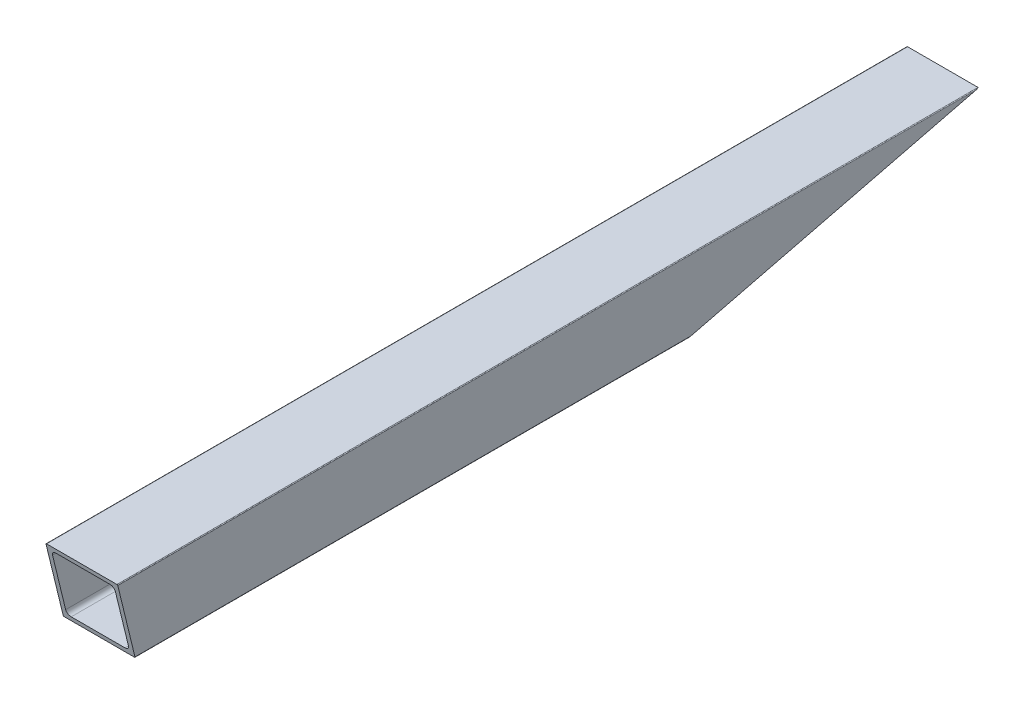
ISO-10303-21;
HEADER;
FILE_DESCRIPTION(('STEP AP214'),'2;1');
FILE_NAME('part.step','',(''),(''),'','','');
FILE_SCHEMA(('AUTOMOTIVE_DESIGN { 1 0 10303 214 1 1 1 1 }'));
ENDSEC;
DATA;
#1=APPLICATION_CONTEXT('core data for automotive mechanical design processes');
#2=APPLICATION_PROTOCOL_DEFINITION('international standard','automotive_design',2000,#1);
#3=PRODUCT_CONTEXT('',#1,'mechanical');
#4=PRODUCT('Part','Part','',(#3));
#5=PRODUCT_RELATED_PRODUCT_CATEGORY('part','',(#4));
#6=PRODUCT_DEFINITION_FORMATION('','',#4);
#7=PRODUCT_DEFINITION_CONTEXT('part definition',#1,'design');
#8=PRODUCT_DEFINITION('design','',#6,#7);
#9=PRODUCT_DEFINITION_SHAPE('','',#8);
#10=(LENGTH_UNIT() NAMED_UNIT(*) SI_UNIT(.MILLI.,.METRE.));
#11=(NAMED_UNIT(*) PLANE_ANGLE_UNIT() SI_UNIT($,.RADIAN.));
#12=(NAMED_UNIT(*) SI_UNIT($,.STERADIAN.) SOLID_ANGLE_UNIT());
#13=UNCERTAINTY_MEASURE_WITH_UNIT(LENGTH_MEASURE(1.E-05),#10,'distance_accuracy_value','');
#14=(GEOMETRIC_REPRESENTATION_CONTEXT(3) GLOBAL_UNCERTAINTY_ASSIGNED_CONTEXT((#13)) GLOBAL_UNIT_ASSIGNED_CONTEXT((#10,
#11,#12)) REPRESENTATION_CONTEXT('',''));
#15=CARTESIAN_POINT('',(0.,0.,0.));
#16=DIRECTION('',(0.,0.,1.));
#17=DIRECTION('',(1.,0.,0.));
#18=AXIS2_PLACEMENT_3D('',#15,#16,#17);
#19=CARTESIAN_POINT('',(1.5875,3.175,1828.8));
#20=DIRECTION('',(1.,0.,0.));
#21=DIRECTION('',(0.,1.,0.));
#22=AXIS2_PLACEMENT_3D('',#19,#20,#21);
#23=PLANE('',#22);
#24=DIRECTION('',(0.,0.971498515495055,0.237045637780794));
#25=VECTOR('',#24,1.);
#26=CARTESIAN_POINT('',(1.5875,227.283946970997,910.320709135263));
#27=LINE('',#26,#25);
#28=CARTESIAN_POINT('',(1.5875,3.175,855.638126074339));
#29=VERTEX_POINT('',#28);
#30=CARTESIAN_POINT('',(1.5875,22.225,860.286326074339));
#31=VERTEX_POINT('',#30);
#32=EDGE_CURVE('E290',#29,#31,#27,.T.);
#33=ORIENTED_EDGE('',*,*,#32,.F.);
#34=DIRECTION('',(0.,0.,-1.));
#35=VECTOR('',#34,1.);
#36=CARTESIAN_POINT('',(1.5875,3.175,1828.8));
#37=LINE('',#36,#35);
#38=CARTESIAN_POINT('',(1.5875,3.175,646.321667142212));
#39=VERTEX_POINT('',#38);
#40=EDGE_CURVE('E210',#29,#39,#37,.T.);
#41=ORIENTED_EDGE('',*,*,#40,.T.);
#42=DIRECTION('',(0.,-0.239881906612022,0.970802076058854));
#43=VECTOR('',#42,1.);
#44=CARTESIAN_POINT('',(1.5875,-272.198015313343,1760.75626011531));
#45=LINE('',#44,#43);
#46=CARTESIAN_POINT('',(1.5875,22.225,569.226317142212));
#47=VERTEX_POINT('',#46);
#48=EDGE_CURVE('E231',#47,#39,#45,.T.);
#49=ORIENTED_EDGE('',*,*,#48,.F.);
#50=DIRECTION('',(0.,0.,-1.));
#51=VECTOR('',#50,1.);
#52=CARTESIAN_POINT('',(1.5875,22.225,1828.8));
#53=LINE('',#52,#51);
#54=EDGE_CURVE('E194',#31,#47,#53,.T.);
#55=ORIENTED_EDGE('',*,*,#54,.F.);
#56=EDGE_LOOP('',(#33,#41,#49,#55));
#57=FACE_BOUND('',#56,.T.);
#58=ADVANCED_FACE('F41',(#57),#23,.T.);
#59=CARTESIAN_POINT('',(3.175,22.225,1828.8));
#60=DIRECTION('',(0.,0.,-1.));
#61=DIRECTION('',(-1.,0.,0.));
#62=AXIS2_PLACEMENT_3D('',#59,#60,#61);
#63=CYLINDRICAL_SURFACE('',#62,1.5875);
#64=DIRECTION('',(0.,0.,-1.));
#65=VECTOR('',#64,1.);
#66=CARTESIAN_POINT('',(3.175,23.8125,1828.8));
#67=LINE('',#66,#65);
#68=CARTESIAN_POINT('',(3.175,23.8125,860.673676074339));
#69=VERTEX_POINT('',#68);
#70=CARTESIAN_POINT('',(3.175,23.8125,562.801704642212));
#71=VERTEX_POINT('',#70);
#72=EDGE_CURVE('E192',#69,#71,#67,.T.);
#73=ORIENTED_EDGE('',*,*,#72,.F.);
#74=CARTESIAN_POINT('',(3.175,22.225,860.286326074339));
#75=DIRECTION('',(0.,0.237045637780794,-0.971498515495055));
#76=DIRECTION('',(0.,-0.971498515495055,-0.237045637780794));
#77=AXIS2_PLACEMENT_3D('',#74,#75,#76);
#78=ELLIPSE('',#77,1.63407352114279,1.5875);
#79=EDGE_CURVE('E292',#69,#31,#78,.F.);
#80=ORIENTED_EDGE('',*,*,#79,.T.);
#81=ORIENTED_EDGE('',*,*,#54,.T.);
#82=CARTESIAN_POINT('',(3.175,22.225,569.226317142212));
#83=DIRECTION('',(0.,0.970802076058854,0.239881906612022));
#84=DIRECTION('',(0.,0.239881906612022,-0.970802076058854));
#85=AXIS2_PLACEMENT_3D('',#82,#83,#84);
#86=ELLIPSE('',#85,6.61783967962024,1.5875);
#87=EDGE_CURVE('E235',#47,#71,#86,.F.);
#88=ORIENTED_EDGE('',*,*,#87,.T.);
#89=EDGE_LOOP('',(#73,#80,#81,#88));
#90=FACE_BOUND('',#89,.T.);
#91=ADVANCED_FACE('F331',(#90),#63,.F.);
#92=CARTESIAN_POINT('',(3.175,23.8125,1828.8));
#93=DIRECTION('',(0.,-1.,0.));
#94=DIRECTION('',(0.,0.,-1.));
#95=AXIS2_PLACEMENT_3D('',#92,#93,#94);
#96=PLANE('',#95);
#97=DIRECTION('',(1.,0.,0.));
#98=VECTOR('',#97,1.);
#99=CARTESIAN_POINT('',(3.175,23.8125,860.673676074339));
#100=LINE('',#99,#98);
#101=CARTESIAN_POINT('',(22.225,23.8125,860.673676074339));
#102=VERTEX_POINT('',#101);
#103=EDGE_CURVE('E294',#69,#102,#100,.T.);
#104=ORIENTED_EDGE('',*,*,#103,.F.);
#105=ORIENTED_EDGE('',*,*,#72,.T.);
#106=DIRECTION('',(-1.,0.,0.));
#107=VECTOR('',#106,1.);
#108=CARTESIAN_POINT('',(3.175,23.8125,562.801704642212));
#109=LINE('',#108,#107);
#110=CARTESIAN_POINT('',(22.225,23.8125,562.801704642212));
#111=VERTEX_POINT('',#110);
#112=EDGE_CURVE('E240',#111,#71,#109,.T.);
#113=ORIENTED_EDGE('',*,*,#112,.F.);
#114=DIRECTION('',(0.,0.,-1.));
#115=VECTOR('',#114,1.);
#116=CARTESIAN_POINT('',(22.225,23.8125,1828.8));
#117=LINE('',#116,#115);
#118=EDGE_CURVE('E191',#102,#111,#117,.T.);
#119=ORIENTED_EDGE('',*,*,#118,.F.);
#120=EDGE_LOOP('',(#104,#105,#113,#119));
#121=FACE_BOUND('',#120,.T.);
#122=ADVANCED_FACE('F336',(#121),#96,.T.);
#123=CARTESIAN_POINT('',(22.225,22.225,1828.8));
#124=DIRECTION('',(0.,0.,-1.));
#125=DIRECTION('',(-1.,0.,0.));
#126=AXIS2_PLACEMENT_3D('',#123,#124,#125);
#127=CYLINDRICAL_SURFACE('',#126,1.5875);
#128=DIRECTION('',(0.,0.,-1.));
#129=VECTOR('',#128,1.);
#130=CARTESIAN_POINT('',(23.8125,22.225,1828.8));
#131=LINE('',#130,#129);
#132=CARTESIAN_POINT('',(23.8125,22.225,860.286326074339));
#133=VERTEX_POINT('',#132);
#134=CARTESIAN_POINT('',(23.8125,22.225,569.226317142211));
#135=VERTEX_POINT('',#134);
#136=EDGE_CURVE('E187',#133,#135,#131,.T.);
#137=ORIENTED_EDGE('',*,*,#136,.F.);
#138=CARTESIAN_POINT('',(22.225,22.225,860.286326074339));
#139=DIRECTION('',(0.,0.237045637780794,-0.971498515495055));
#140=DIRECTION('',(0.,-0.971498515495055,-0.237045637780794));
#141=AXIS2_PLACEMENT_3D('',#138,#139,#140);
#142=ELLIPSE('',#141,1.63407352114279,1.5875);
#143=EDGE_CURVE('E296',#133,#102,#142,.F.);
#144=ORIENTED_EDGE('',*,*,#143,.T.);
#145=ORIENTED_EDGE('',*,*,#118,.T.);
#146=CARTESIAN_POINT('',(22.225,22.225,569.226317142212));
#147=DIRECTION('',(0.,0.970802076058854,0.239881906612022));
#148=DIRECTION('',(0.,0.239881906612022,-0.970802076058854));
#149=AXIS2_PLACEMENT_3D('',#146,#147,#148);
#150=ELLIPSE('',#149,6.61783967962024,1.5875);
#151=EDGE_CURVE('E261',#111,#135,#150,.F.);
#152=ORIENTED_EDGE('',*,*,#151,.T.);
#153=EDGE_LOOP('',(#137,#144,#145,#152));
#154=FACE_BOUND('',#153,.T.);
#155=ADVANCED_FACE('F267',(#154),#127,.F.);
#156=CARTESIAN_POINT('',(23.8125,3.175,1828.8));
#157=DIRECTION('',(-1.,0.,0.));
#158=DIRECTION('',(0.,0.,1.));
#159=AXIS2_PLACEMENT_3D('',#156,#157,#158);
#160=PLANE('',#159);
#161=DIRECTION('',(0.,-0.971498515495055,-0.237045637780794));
#162=VECTOR('',#161,1.);
#163=CARTESIAN_POINT('',(23.8125,227.283946970997,910.320709135263));
#164=LINE('',#163,#162);
#165=CARTESIAN_POINT('',(23.8125,3.175,855.638126074339));
#166=VERTEX_POINT('',#165);
#167=EDGE_CURVE('E253',#133,#166,#164,.T.);
#168=ORIENTED_EDGE('',*,*,#167,.F.);
#169=ORIENTED_EDGE('',*,*,#136,.T.);
#170=DIRECTION('',(0.,0.239881906612022,-0.970802076058854));
#171=VECTOR('',#170,1.);
#172=CARTESIAN_POINT('',(23.8125,-272.198015313343,1760.75626011531));
#173=LINE('',#172,#171);
#174=CARTESIAN_POINT('',(23.8125,3.175,646.321667142212));
#175=VERTEX_POINT('',#174);
#176=EDGE_CURVE('E252',#175,#135,#173,.T.);
#177=ORIENTED_EDGE('',*,*,#176,.F.);
#178=DIRECTION('',(0.,0.,-1.));
#179=VECTOR('',#178,1.);
#180=CARTESIAN_POINT('',(23.8125,3.175,1828.8));
#181=LINE('',#180,#179);
#182=EDGE_CURVE('E185',#166,#175,#181,.T.);
#183=ORIENTED_EDGE('',*,*,#182,.F.);
#184=EDGE_LOOP('',(#168,#169,#177,#183));
#185=FACE_BOUND('',#184,.T.);
#186=ADVANCED_FACE('F250',(#185),#160,.T.);
#187=CARTESIAN_POINT('',(22.225,3.175,1828.8));
#188=DIRECTION('',(0.,0.,-1.));
#189=DIRECTION('',(-1.,0.,0.));
#190=AXIS2_PLACEMENT_3D('',#187,#188,#189);
#191=CYLINDRICAL_SURFACE('',#190,1.5875);
#192=DIRECTION('',(0.,0.,-1.));
#193=VECTOR('',#192,1.);
#194=CARTESIAN_POINT('',(22.225,1.5875,1828.8));
#195=LINE('',#194,#193);
#196=CARTESIAN_POINT('',(22.225,1.5875,855.250776074339));
#197=VERTEX_POINT('',#196);
#198=CARTESIAN_POINT('',(22.225,1.5875,652.746279642212));
#199=VERTEX_POINT('',#198);
#200=EDGE_CURVE('E188',#197,#199,#195,.T.);
#201=ORIENTED_EDGE('',*,*,#200,.F.);
#202=CARTESIAN_POINT('',(22.225,3.175,855.638126074339));
#203=DIRECTION('',(0.,0.237045637780794,-0.971498515495055));
#204=DIRECTION('',(0.,-0.971498515495055,-0.237045637780794));
#205=AXIS2_PLACEMENT_3D('',#202,#203,#204);
#206=ELLIPSE('',#205,1.63407352114279,1.5875);
#207=EDGE_CURVE('E299',#197,#166,#206,.F.);
#208=ORIENTED_EDGE('',*,*,#207,.T.);
#209=ORIENTED_EDGE('',*,*,#182,.T.);
#210=CARTESIAN_POINT('',(22.225,3.175,646.321667142212));
#211=DIRECTION('',(0.,0.970802076058854,0.239881906612022));
#212=DIRECTION('',(0.,0.239881906612022,-0.970802076058854));
#213=AXIS2_PLACEMENT_3D('',#210,#211,#212);
#214=ELLIPSE('',#213,6.61783967962024,1.5875);
#215=EDGE_CURVE('E265',#175,#199,#214,.F.);
#216=ORIENTED_EDGE('',*,*,#215,.T.);
#217=EDGE_LOOP('',(#201,#208,#209,#216));
#218=FACE_BOUND('',#217,.T.);
#219=ADVANCED_FACE('F346',(#218),#191,.F.);
#220=CARTESIAN_POINT('',(3.175,1.5875,1828.8));
#221=DIRECTION('',(0.,1.,0.));
#222=DIRECTION('',(1.,0.,0.));
#223=AXIS2_PLACEMENT_3D('',#220,#221,#222);
#224=PLANE('',#223);
#225=DIRECTION('',(-1.,0.,0.));
#226=VECTOR('',#225,1.);
#227=CARTESIAN_POINT('',(3.175,1.5875,855.250776074339));
#228=LINE('',#227,#226);
#229=CARTESIAN_POINT('',(3.175,1.5875,855.250776074339));
#230=VERTEX_POINT('',#229);
#231=EDGE_CURVE('E55',#197,#230,#228,.T.);
#232=ORIENTED_EDGE('',*,*,#231,.F.);
#233=ORIENTED_EDGE('',*,*,#200,.T.);
#234=DIRECTION('',(1.,0.,0.));
#235=VECTOR('',#234,1.);
#236=CARTESIAN_POINT('',(3.175,1.5875,652.746279642212));
#237=LINE('',#236,#235);
#238=CARTESIAN_POINT('',(3.175,1.5875,652.746279642212));
#239=VERTEX_POINT('',#238);
#240=EDGE_CURVE('E272',#239,#199,#237,.T.);
#241=ORIENTED_EDGE('',*,*,#240,.F.);
#242=DIRECTION('',(0.,0.,-1.));
#243=VECTOR('',#242,1.);
#244=CARTESIAN_POINT('',(3.175,1.5875,1828.8));
#245=LINE('',#244,#243);
#246=EDGE_CURVE('E211',#230,#239,#245,.T.);
#247=ORIENTED_EDGE('',*,*,#246,.F.);
#248=EDGE_LOOP('',(#232,#233,#241,#247));
#249=FACE_BOUND('',#248,.T.);
#250=ADVANCED_FACE('F343',(#249),#224,.T.);
#251=CARTESIAN_POINT('',(3.175,3.175,1828.8));
#252=DIRECTION('',(0.,0.,-1.));
#253=DIRECTION('',(-1.,0.,0.));
#254=AXIS2_PLACEMENT_3D('',#251,#252,#253);
#255=CYLINDRICAL_SURFACE('',#254,1.5875);
#256=ORIENTED_EDGE('',*,*,#40,.F.);
#257=CARTESIAN_POINT('',(3.175,3.175,855.638126074339));
#258=DIRECTION('',(0.,0.237045637780794,-0.971498515495055));
#259=DIRECTION('',(0.,-0.971498515495055,-0.237045637780794));
#260=AXIS2_PLACEMENT_3D('',#257,#258,#259);
#261=ELLIPSE('',#260,1.63407352114279,1.5875);
#262=EDGE_CURVE('E303',#29,#230,#261,.F.);
#263=ORIENTED_EDGE('',*,*,#262,.T.);
#264=ORIENTED_EDGE('',*,*,#246,.T.);
#265=CARTESIAN_POINT('',(3.175,3.175,646.321667142212));
#266=DIRECTION('',(0.,0.970802076058854,0.239881906612022));
#267=DIRECTION('',(0.,0.239881906612022,-0.970802076058854));
#268=AXIS2_PLACEMENT_3D('',#265,#266,#267);
#269=ELLIPSE('',#268,6.61783967962024,1.5875);
#270=EDGE_CURVE('E274',#239,#39,#269,.F.);
#271=ORIENTED_EDGE('',*,*,#270,.T.);
#272=EDGE_LOOP('',(#256,#263,#264,#271));
#273=FACE_BOUND('',#272,.T.);
#274=ADVANCED_FACE('F339',(#273),#255,.F.);
#275=CARTESIAN_POINT('',(0.,0.254,1828.8));
#276=DIRECTION('',(1.,0.,0.));
#277=DIRECTION('',(0.,1.,0.));
#278=AXIS2_PLACEMENT_3D('',#275,#276,#277);
#279=PLANE('',#278);
#280=DIRECTION('',(0.,0.,-1.));
#281=VECTOR('',#280,1.);
#282=CARTESIAN_POINT('',(0.,0.254,1828.8));
#283=LINE('',#282,#281);
#284=CARTESIAN_POINT('',(0.,0.254,854.925402074339));
#285=VERTEX_POINT('',#284);
#286=CARTESIAN_POINT('',(0.,0.254,658.142954142211));
#287=VERTEX_POINT('',#286);
#288=EDGE_CURVE('E179',#285,#287,#283,.T.);
#289=ORIENTED_EDGE('',*,*,#288,.F.);
#290=DIRECTION('',(0.,0.971498515495055,0.237045637780794));
#291=VECTOR('',#290,1.);
#292=CARTESIAN_POINT('',(0.,224.527079814053,909.648033548968));
#293=LINE('',#292,#291);
#294=CARTESIAN_POINT('',(0.,25.146,860.999050074339));
#295=VERTEX_POINT('',#294);
#296=EDGE_CURVE('E62',#285,#295,#293,.T.);
#297=ORIENTED_EDGE('',*,*,#296,.T.);
#298=DIRECTION('',(0.,0.,-1.));
#299=VECTOR('',#298,1.);
#300=CARTESIAN_POINT('',(0.,25.146,1828.8));
#301=LINE('',#300,#299);
#302=CARTESIAN_POINT('',(0.,25.146,557.405030142211));
#303=VERTEX_POINT('',#302);
#304=EDGE_CURVE('E208',#295,#303,#301,.T.);
#305=ORIENTED_EDGE('',*,*,#304,.T.);
#306=DIRECTION('',(0.,-0.239881906612022,0.970802076058854));
#307=VECTOR('',#306,1.);
#308=CARTESIAN_POINT('',(0.,-272.366099377702,1761.43649632377));
#309=LINE('',#308,#307);
#310=EDGE_CURVE('E282',#303,#287,#309,.T.);
#311=ORIENTED_EDGE('',*,*,#310,.T.);
#312=EDGE_LOOP('',(#289,#297,#305,#311));
#313=FACE_BOUND('',#312,.T.);
#314=ADVANCED_FACE('F316',(#313),#279,.F.);
#315=CARTESIAN_POINT('',(0.254,25.146,1828.8));
#316=DIRECTION('',(0.,0.,-1.));
#317=DIRECTION('',(-1.,0.,0.));
#318=AXIS2_PLACEMENT_3D('',#315,#316,#317);
#319=CYLINDRICAL_SURFACE('',#318,0.254);
#320=CARTESIAN_POINT('',(0.254,25.146,860.999050074339));
#321=DIRECTION('',(0.,0.237045637780794,-0.971498515495055));
#322=DIRECTION('',(0.,-0.971498515495055,-0.237045637780794));
#323=AXIS2_PLACEMENT_3D('',#320,#321,#322);
#324=ELLIPSE('',#323,0.261451763382847,0.254);
#325=CARTESIAN_POINT('',(0.254000000000004,25.4,861.061026074339));
#326=VERTEX_POINT('',#325);
#327=EDGE_CURVE('E161',#326,#295,#324,.F.);
#328=ORIENTED_EDGE('',*,*,#327,.F.);
#329=DIRECTION('',(0.,0.,-1.));
#330=VECTOR('',#329,1.);
#331=CARTESIAN_POINT('',(0.254,25.4,1828.8));
#332=LINE('',#331,#330);
#333=CARTESIAN_POINT('',(0.254000000000004,25.4,556.377092142212));
#334=VERTEX_POINT('',#333);
#335=EDGE_CURVE('E183',#326,#334,#332,.T.);
#336=ORIENTED_EDGE('',*,*,#335,.T.);
#337=CARTESIAN_POINT('',(0.254,25.146,557.405030142212));
#338=DIRECTION('',(0.,0.970802076058854,0.239881906612022));
#339=DIRECTION('',(0.,0.239881906612022,-0.970802076058854));
#340=AXIS2_PLACEMENT_3D('',#337,#338,#339);
#341=ELLIPSE('',#340,1.05885434873924,0.254);
#342=EDGE_CURVE('E280',#303,#334,#341,.F.);
#343=ORIENTED_EDGE('',*,*,#342,.F.);
#344=ORIENTED_EDGE('',*,*,#304,.F.);
#345=EDGE_LOOP('',(#328,#336,#343,#344));
#346=FACE_BOUND('',#345,.T.);
#347=ADVANCED_FACE('F314',(#346),#319,.T.);
#348=CARTESIAN_POINT('',(0.254,25.4,1828.8));
#349=DIRECTION('',(0.,-1.,0.));
#350=DIRECTION('',(0.,0.,-1.));
#351=AXIS2_PLACEMENT_3D('',#348,#349,#350);
#352=PLANE('',#351);
#353=ORIENTED_EDGE('',*,*,#335,.F.);
#354=DIRECTION('',(1.,0.,0.));
#355=VECTOR('',#354,1.);
#356=CARTESIAN_POINT('',(-71.374,25.4,861.061026074339));
#357=LINE('',#356,#355);
#358=CARTESIAN_POINT('',(25.146,25.4,861.061026074339));
#359=VERTEX_POINT('',#358);
#360=EDGE_CURVE('E308',#326,#359,#357,.T.);
#361=ORIENTED_EDGE('',*,*,#360,.T.);
#362=DIRECTION('',(0.,0.,-1.));
#363=VECTOR('',#362,1.);
#364=CARTESIAN_POINT('',(25.146,25.4,1828.8));
#365=LINE('',#364,#363);
#366=CARTESIAN_POINT('',(25.146,25.4,556.377092142212));
#367=VERTEX_POINT('',#366);
#368=EDGE_CURVE('E177',#359,#367,#365,.T.);
#369=ORIENTED_EDGE('',*,*,#368,.T.);
#370=DIRECTION('',(1.,0.,0.));
#371=VECTOR('',#370,1.);
#372=CARTESIAN_POINT('',(-71.374,25.4,556.377092142212));
#373=LINE('',#372,#371);
#374=EDGE_CURVE('E285',#334,#367,#373,.T.);
#375=ORIENTED_EDGE('',*,*,#374,.F.);
#376=EDGE_LOOP('',(#353,#361,#369,#375));
#377=FACE_BOUND('',#376,.T.);
#378=ADVANCED_FACE('F310',(#377),#352,.F.);
#379=CARTESIAN_POINT('',(25.146,25.146,1828.8));
#380=DIRECTION('',(0.,0.,-1.));
#381=DIRECTION('',(-1.,0.,0.));
#382=AXIS2_PLACEMENT_3D('',#379,#380,#381);
#383=CYLINDRICAL_SURFACE('',#382,0.254);
#384=CARTESIAN_POINT('',(25.146,25.146,860.999050074339));
#385=DIRECTION('',(0.,0.237045637780794,-0.971498515495055));
#386=DIRECTION('',(0.,-0.971498515495055,-0.237045637780794));
#387=AXIS2_PLACEMENT_3D('',#384,#385,#386);
#388=ELLIPSE('',#387,0.261451763382847,0.254);
#389=CARTESIAN_POINT('',(25.4,25.146,860.999050074339));
#390=VERTEX_POINT('',#389);
#391=EDGE_CURVE('E160',#390,#359,#388,.F.);
#392=ORIENTED_EDGE('',*,*,#391,.F.);
#393=DIRECTION('',(0.,0.,-1.));
#394=VECTOR('',#393,1.);
#395=CARTESIAN_POINT('',(25.4,25.146,1828.8));
#396=LINE('',#395,#394);
#397=CARTESIAN_POINT('',(25.4,25.1460000000001,557.405030142211));
#398=VERTEX_POINT('',#397);
#399=EDGE_CURVE('E169',#390,#398,#396,.T.);
#400=ORIENTED_EDGE('',*,*,#399,.T.);
#401=CARTESIAN_POINT('',(25.146,25.146,557.405030142212));
#402=DIRECTION('',(0.,0.970802076058854,0.239881906612022));
#403=DIRECTION('',(0.,0.239881906612022,-0.970802076058854));
#404=AXIS2_PLACEMENT_3D('',#401,#402,#403);
#405=ELLIPSE('',#404,1.05885434873924,0.254);
#406=EDGE_CURVE('E276',#367,#398,#405,.F.);
#407=ORIENTED_EDGE('',*,*,#406,.F.);
#408=ORIENTED_EDGE('',*,*,#368,.F.);
#409=EDGE_LOOP('',(#392,#400,#407,#408));
#410=FACE_BOUND('',#409,.T.);
#411=ADVANCED_FACE('F313',(#410),#383,.T.);
#412=CARTESIAN_POINT('',(25.4,0.254,1828.8));
#413=DIRECTION('',(-1.,0.,0.));
#414=DIRECTION('',(0.,0.,1.));
#415=AXIS2_PLACEMENT_3D('',#412,#413,#414);
#416=PLANE('',#415);
#417=ORIENTED_EDGE('',*,*,#399,.F.);
#418=DIRECTION('',(0.,0.971498515495055,0.237045637780794));
#419=VECTOR('',#418,1.);
#420=CARTESIAN_POINT('',(25.4,25.4,861.061026074339));
#421=LINE('',#420,#419);
#422=CARTESIAN_POINT('',(25.4,0.253999999999997,854.925402074339));
#423=VERTEX_POINT('',#422);
#424=EDGE_CURVE('E153',#423,#390,#421,.T.);
#425=ORIENTED_EDGE('',*,*,#424,.F.);
#426=DIRECTION('',(0.,0.,-1.));
#427=VECTOR('',#426,1.);
#428=CARTESIAN_POINT('',(25.4,0.254,1828.8));
#429=LINE('',#428,#427);
#430=CARTESIAN_POINT('',(25.4,0.254000000000171,658.14295414221));
#431=VERTEX_POINT('',#430);
#432=EDGE_CURVE('E167',#423,#431,#429,.T.);
#433=ORIENTED_EDGE('',*,*,#432,.T.);
#434=DIRECTION('',(0.,-0.239881906612022,0.970802076058854));
#435=VECTOR('',#434,1.);
#436=CARTESIAN_POINT('',(25.4,0.,659.170892142212));
#437=LINE('',#436,#435);
#438=EDGE_CURVE('E287',#398,#431,#437,.T.);
#439=ORIENTED_EDGE('',*,*,#438,.F.);
#440=EDGE_LOOP('',(#417,#425,#433,#439));
#441=FACE_BOUND('',#440,.T.);
#442=ADVANCED_FACE('F165',(#441),#416,.F.);
#443=CARTESIAN_POINT('',(25.146,0.254,1828.8));
#444=DIRECTION('',(0.,0.,-1.));
#445=DIRECTION('',(-1.,0.,0.));
#446=AXIS2_PLACEMENT_3D('',#443,#444,#445);
#447=CYLINDRICAL_SURFACE('',#446,0.254);
#448=CARTESIAN_POINT('',(25.146,0.254,854.925402074339));
#449=DIRECTION('',(0.,0.237045637780794,-0.971498515495055));
#450=DIRECTION('',(0.,-0.971498515495055,-0.237045637780794));
#451=AXIS2_PLACEMENT_3D('',#448,#449,#450);
#452=ELLIPSE('',#451,0.261451763382847,0.254);
#453=CARTESIAN_POINT('',(25.146,0.,854.863426074339));
#454=VERTEX_POINT('',#453);
#455=EDGE_CURVE('E150',#454,#423,#452,.F.);
#456=ORIENTED_EDGE('',*,*,#455,.F.);
#457=DIRECTION('',(0.,0.,-1.));
#458=VECTOR('',#457,1.);
#459=CARTESIAN_POINT('',(25.146,0.,1828.8));
#460=LINE('',#459,#458);
#461=CARTESIAN_POINT('',(25.146,0.,659.170892142212));
#462=VERTEX_POINT('',#461);
#463=EDGE_CURVE('E175',#454,#462,#460,.T.);
#464=ORIENTED_EDGE('',*,*,#463,.T.);
#465=CARTESIAN_POINT('',(25.146,0.254,658.142954142211));
#466=DIRECTION('',(0.,0.970802076058854,0.239881906612022));
#467=DIRECTION('',(0.,0.239881906612022,-0.970802076058854));
#468=AXIS2_PLACEMENT_3D('',#465,#466,#467);
#469=ELLIPSE('',#468,1.05885434873924,0.254);
#470=EDGE_CURVE('E174',#431,#462,#469,.F.);
#471=ORIENTED_EDGE('',*,*,#470,.F.);
#472=ORIENTED_EDGE('',*,*,#432,.F.);
#473=EDGE_LOOP('',(#456,#464,#471,#472));
#474=FACE_BOUND('',#473,.T.);
#475=ADVANCED_FACE('F172',(#474),#447,.T.);
#476=CARTESIAN_POINT('',(0.254,0.,1828.8));
#477=DIRECTION('',(0.,1.,0.));
#478=DIRECTION('',(1.,0.,0.));
#479=AXIS2_PLACEMENT_3D('',#476,#477,#478);
#480=PLANE('',#479);
#481=ORIENTED_EDGE('',*,*,#463,.F.);
#482=DIRECTION('',(1.,0.,0.));
#483=VECTOR('',#482,1.);
#484=CARTESIAN_POINT('',(-71.374,0.,854.863426074339));
#485=LINE('',#484,#483);
#486=CARTESIAN_POINT('',(0.254000000000004,0.,854.863426074339));
#487=VERTEX_POINT('',#486);
#488=EDGE_CURVE('E156',#487,#454,#485,.T.);
#489=ORIENTED_EDGE('',*,*,#488,.F.);
#490=DIRECTION('',(0.,0.,-1.));
#491=VECTOR('',#490,1.);
#492=CARTESIAN_POINT('',(0.254,0.,1828.8));
#493=LINE('',#492,#491);
#494=CARTESIAN_POINT('',(0.254,0.,659.170892142212));
#495=VERTEX_POINT('',#494);
#496=EDGE_CURVE('E190',#487,#495,#493,.T.);
#497=ORIENTED_EDGE('',*,*,#496,.T.);
#498=DIRECTION('',(1.,0.,0.));
#499=VECTOR('',#498,1.);
#500=CARTESIAN_POINT('',(-71.374,0.,659.170892142212));
#501=LINE('',#500,#499);
#502=EDGE_CURVE('E284',#495,#462,#501,.T.);
#503=ORIENTED_EDGE('',*,*,#502,.T.);
#504=EDGE_LOOP('',(#481,#489,#497,#503));
#505=FACE_BOUND('',#504,.T.);
#506=ADVANCED_FACE('F319',(#505),#480,.F.);
#507=CARTESIAN_POINT('',(0.254,0.254,1828.8));
#508=DIRECTION('',(0.,0.,-1.));
#509=DIRECTION('',(-1.,0.,0.));
#510=AXIS2_PLACEMENT_3D('',#507,#508,#509);
#511=CYLINDRICAL_SURFACE('',#510,0.254);
#512=CARTESIAN_POINT('',(0.254,0.254,854.925402074339));
#513=DIRECTION('',(0.,0.237045637780794,-0.971498515495055));
#514=DIRECTION('',(0.,-0.971498515495055,-0.237045637780794));
#515=AXIS2_PLACEMENT_3D('',#512,#513,#514);
#516=ELLIPSE('',#515,0.261451763382847,0.254);
#517=EDGE_CURVE('E11',#285,#487,#516,.F.);
#518=ORIENTED_EDGE('',*,*,#517,.F.);
#519=ORIENTED_EDGE('',*,*,#288,.T.);
#520=CARTESIAN_POINT('',(0.254,0.254,658.142954142211));
#521=DIRECTION('',(0.,0.970802076058854,0.239881906612022));
#522=DIRECTION('',(0.,0.239881906612022,-0.970802076058854));
#523=AXIS2_PLACEMENT_3D('',#520,#521,#522);
#524=ELLIPSE('',#523,1.05885434873924,0.254);
#525=EDGE_CURVE('E48',#495,#287,#524,.F.);
#526=ORIENTED_EDGE('',*,*,#525,.F.);
#527=ORIENTED_EDGE('',*,*,#496,.F.);
#528=EDGE_LOOP('',(#518,#519,#526,#527));
#529=FACE_BOUND('',#528,.T.);
#530=ADVANCED_FACE('F318',(#529),#511,.T.);
#531=CARTESIAN_POINT('',(-71.374,0.,659.170892142212));
#532=DIRECTION('',(0.,0.970802076058854,0.239881906612022));
#533=DIRECTION('',(0.,-0.239881906612022,0.970802076058854));
#534=AXIS2_PLACEMENT_3D('',#531,#532,#533);
#535=PLANE('',#534);
#536=ORIENTED_EDGE('',*,*,#48,.T.);
#537=ORIENTED_EDGE('',*,*,#270,.F.);
#538=ORIENTED_EDGE('',*,*,#240,.T.);
#539=ORIENTED_EDGE('',*,*,#215,.F.);
#540=ORIENTED_EDGE('',*,*,#176,.T.);
#541=ORIENTED_EDGE('',*,*,#151,.F.);
#542=ORIENTED_EDGE('',*,*,#112,.T.);
#543=ORIENTED_EDGE('',*,*,#87,.F.);
#544=EDGE_LOOP('',(#536,#537,#538,#539,#540,#541,#542,#543));
#545=FACE_BOUND('',#544,.T.);
#546=ORIENTED_EDGE('',*,*,#406,.T.);
#547=ORIENTED_EDGE('',*,*,#438,.T.);
#548=ORIENTED_EDGE('',*,*,#470,.T.);
#549=ORIENTED_EDGE('',*,*,#502,.F.);
#550=ORIENTED_EDGE('',*,*,#525,.T.);
#551=ORIENTED_EDGE('',*,*,#310,.F.);
#552=ORIENTED_EDGE('',*,*,#342,.T.);
#553=ORIENTED_EDGE('',*,*,#374,.T.);
#554=EDGE_LOOP('',(#546,#547,#548,#549,#550,#551,#552,#553));
#555=FACE_BOUND('',#554,.T.);
#556=ADVANCED_FACE('F259',(#545,#555),#535,.F.);
#557=CARTESIAN_POINT('',(-71.374,25.4,861.061026074339));
#558=DIRECTION('',(0.,0.237045637780794,-0.971498515495055));
#559=DIRECTION('',(0.,0.971498515495055,0.237045637780794));
#560=AXIS2_PLACEMENT_3D('',#557,#558,#559);
#561=PLANE('',#560);
#562=ORIENTED_EDGE('',*,*,#32,.T.);
#563=ORIENTED_EDGE('',*,*,#79,.F.);
#564=ORIENTED_EDGE('',*,*,#103,.T.);
#565=ORIENTED_EDGE('',*,*,#143,.F.);
#566=ORIENTED_EDGE('',*,*,#167,.T.);
#567=ORIENTED_EDGE('',*,*,#207,.F.);
#568=ORIENTED_EDGE('',*,*,#231,.T.);
#569=ORIENTED_EDGE('',*,*,#262,.F.);
#570=EDGE_LOOP('',(#562,#563,#564,#565,#566,#567,#568,#569));
#571=FACE_BOUND('',#570,.T.);
#572=ORIENTED_EDGE('',*,*,#391,.T.);
#573=ORIENTED_EDGE('',*,*,#360,.F.);
#574=ORIENTED_EDGE('',*,*,#327,.T.);
#575=ORIENTED_EDGE('',*,*,#296,.F.);
#576=ORIENTED_EDGE('',*,*,#517,.T.);
#577=ORIENTED_EDGE('',*,*,#488,.T.);
#578=ORIENTED_EDGE('',*,*,#455,.T.);
#579=ORIENTED_EDGE('',*,*,#424,.T.);
#580=EDGE_LOOP('',(#572,#573,#574,#575,#576,#577,#578,#579));
#581=FACE_BOUND('',#580,.T.);
#582=ADVANCED_FACE('F152',(#571,#581),#561,.F.);
#583=CLOSED_SHELL('',(#58,#91,#122,#155,#186,#219,#250,#274,#314,#347,#378,#411,#442,#475,#506,
#530,#556,#582));
#584=MANIFOLD_SOLID_BREP('B2',#583);
#585=ADVANCED_BREP_SHAPE_REPRESENTATION('',(#18,#584),#14);
#586=SHAPE_DEFINITION_REPRESENTATION(#9,#585);
ENDSEC;
END-ISO-10303-21;
